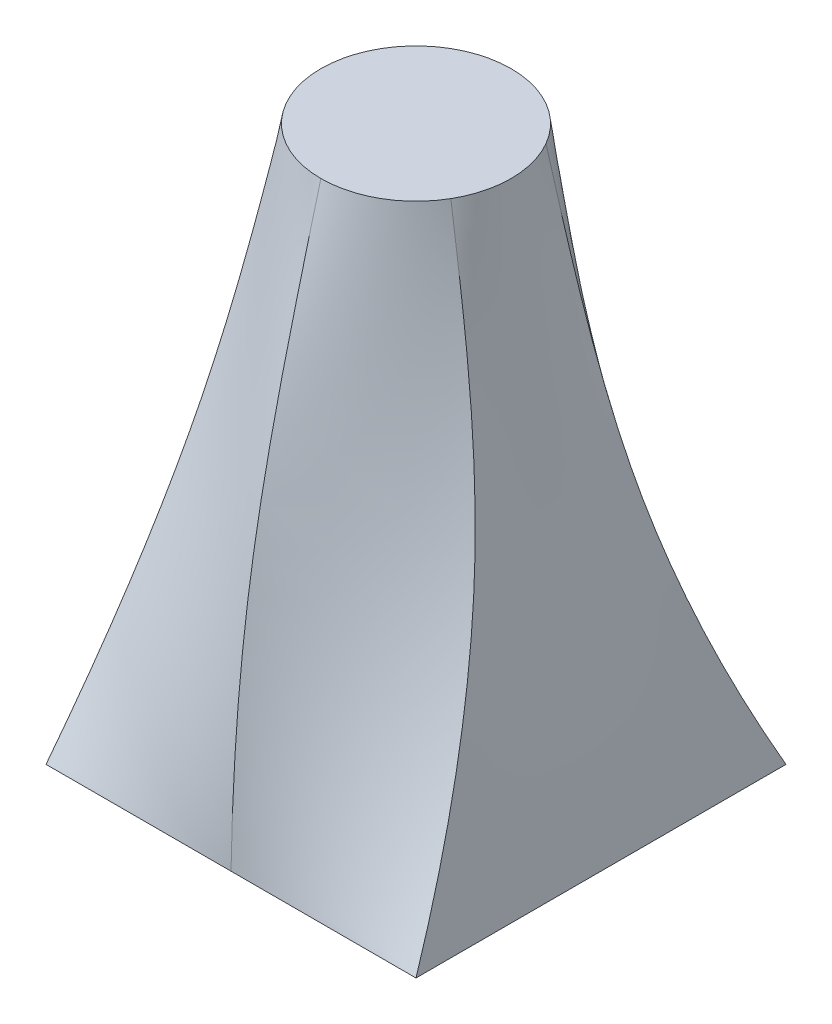
ISO-10303-21;
HEADER;
FILE_DESCRIPTION(('STEP AP214'),'2;1');
FILE_NAME('part.step','',(''),(''),'','','');
FILE_SCHEMA(('AUTOMOTIVE_DESIGN { 1 0 10303 214 1 1 1 1 }'));
ENDSEC;
DATA;
#1=APPLICATION_CONTEXT('core data for automotive mechanical design processes');
#2=APPLICATION_PROTOCOL_DEFINITION('international standard','automotive_design',2000,#1);
#3=PRODUCT_CONTEXT('',#1,'mechanical');
#4=PRODUCT('Part','Part','',(#3));
#5=PRODUCT_RELATED_PRODUCT_CATEGORY('part','',(#4));
#6=PRODUCT_DEFINITION_FORMATION('','',#4);
#7=PRODUCT_DEFINITION_CONTEXT('part definition',#1,'design');
#8=PRODUCT_DEFINITION('design','',#6,#7);
#9=PRODUCT_DEFINITION_SHAPE('','',#8);
#10=(LENGTH_UNIT() NAMED_UNIT(*) SI_UNIT(.MILLI.,.METRE.));
#11=(NAMED_UNIT(*) PLANE_ANGLE_UNIT() SI_UNIT($,.RADIAN.));
#12=(NAMED_UNIT(*) SI_UNIT($,.STERADIAN.) SOLID_ANGLE_UNIT());
#13=UNCERTAINTY_MEASURE_WITH_UNIT(LENGTH_MEASURE(1.E-05),#10,'distance_accuracy_value','');
#14=(GEOMETRIC_REPRESENTATION_CONTEXT(3) GLOBAL_UNCERTAINTY_ASSIGNED_CONTEXT((#13)) GLOBAL_UNIT_ASSIGNED_CONTEXT((#10,
#11,#12)) REPRESENTATION_CONTEXT('',''));
#15=CARTESIAN_POINT('',(0.,0.,0.));
#16=DIRECTION('',(0.,0.,1.));
#17=DIRECTION('',(1.,0.,0.));
#18=AXIS2_PLACEMENT_3D('',#15,#16,#17);
#19=CARTESIAN_POINT('',(0.,152.4,0.));
#20=DIRECTION('',(0.,1.,0.));
#21=DIRECTION('',(0.,0.,1.));
#22=AXIS2_PLACEMENT_3D('',#19,#20,#21);
#23=PLANE('',#22);
#24=CARTESIAN_POINT('',(0.,152.4,0.));
#25=DIRECTION('',(0.,1.,0.));
#26=DIRECTION('',(0.,0.,1.));
#27=AXIS2_PLACEMENT_3D('',#24,#25,#26);
#28=CIRCLE('',#27,26.1274271172022);
#29=CARTESIAN_POINT('',(0.,152.4,-26.1274271172022));
#30=VERTEX_POINT('',#29);
#31=CARTESIAN_POINT('',(-22.6270156190236,152.4,-13.0637135586011));
#32=VERTEX_POINT('',#31);
#33=EDGE_CURVE('E12',#30,#32,#28,.T.);
#34=ORIENTED_EDGE('',*,*,#33,.T.);
#35=CARTESIAN_POINT('',(-22.6270156190235,152.4,13.0637135586012));
#36=VERTEX_POINT('',#35);
#37=EDGE_CURVE('E89',#32,#36,#28,.T.);
#38=ORIENTED_EDGE('',*,*,#37,.T.);
#39=CARTESIAN_POINT('',(0.,152.4,26.1274271172022));
#40=VERTEX_POINT('',#39);
#41=EDGE_CURVE('E253',#36,#40,#28,.T.);
#42=ORIENTED_EDGE('',*,*,#41,.T.);
#43=CARTESIAN_POINT('',(22.6270156190236,152.4,13.0637135586009));
#44=VERTEX_POINT('',#43);
#45=EDGE_CURVE('E103',#40,#44,#28,.T.);
#46=ORIENTED_EDGE('',*,*,#45,.T.);
#47=CARTESIAN_POINT('',(22.6270156190234,152.4,-13.0637135586014));
#48=VERTEX_POINT('',#47);
#49=EDGE_CURVE('E97',#44,#48,#28,.T.);
#50=ORIENTED_EDGE('',*,*,#49,.T.);
#51=EDGE_CURVE('E166',#48,#30,#28,.T.);
#52=ORIENTED_EDGE('',*,*,#51,.T.);
#53=EDGE_LOOP('',(#34,#38,#42,#46,#50,#52));
#54=FACE_BOUND('',#53,.T.);
#55=ADVANCED_FACE('F79',(#54),#23,.T.);
#56=CARTESIAN_POINT('',(0.,0.,0.));
#57=DIRECTION('',(0.,1.,0.));
#58=DIRECTION('',(0.,0.,1.));
#59=AXIS2_PLACEMENT_3D('',#56,#57,#58);
#60=PLANE('',#59);
#61=DIRECTION('',(0.,0.,-1.));
#62=VECTOR('',#61,1.);
#63=CARTESIAN_POINT('',(50.8,0.,50.8));
#64=LINE('',#63,#62);
#65=CARTESIAN_POINT('',(50.8,0.,50.8));
#66=VERTEX_POINT('',#65);
#67=CARTESIAN_POINT('',(50.8,0.,-50.8));
#68=VERTEX_POINT('',#67);
#69=EDGE_CURVE('E141',#66,#68,#64,.T.);
#70=ORIENTED_EDGE('',*,*,#69,.F.);
#71=DIRECTION('',(1.,0.,0.));
#72=VECTOR('',#71,1.);
#73=CARTESIAN_POINT('',(0.,0.,50.8));
#74=LINE('',#73,#72);
#75=CARTESIAN_POINT('',(0.,0.,50.8));
#76=VERTEX_POINT('',#75);
#77=EDGE_CURVE('E161',#76,#66,#74,.T.);
#78=ORIENTED_EDGE('',*,*,#77,.F.);
#79=CARTESIAN_POINT('',(-50.8,0.,50.8));
#80=VERTEX_POINT('',#79);
#81=EDGE_CURVE('E321',#80,#76,#74,.T.);
#82=ORIENTED_EDGE('',*,*,#81,.F.);
#83=DIRECTION('',(0.,0.,1.));
#84=VECTOR('',#83,1.);
#85=CARTESIAN_POINT('',(-50.8,0.,50.8));
#86=LINE('',#85,#84);
#87=CARTESIAN_POINT('',(-50.8,0.,-50.8));
#88=VERTEX_POINT('',#87);
#89=EDGE_CURVE('E323',#88,#80,#86,.T.);
#90=ORIENTED_EDGE('',*,*,#89,.F.);
#91=DIRECTION('',(-1.,0.,0.));
#92=VECTOR('',#91,1.);
#93=CARTESIAN_POINT('',(-50.8,0.,-50.8));
#94=LINE('',#93,#92);
#95=CARTESIAN_POINT('',(0.,0.,-50.8));
#96=VERTEX_POINT('',#95);
#97=EDGE_CURVE('E144',#96,#88,#94,.T.);
#98=ORIENTED_EDGE('',*,*,#97,.F.);
#99=EDGE_CURVE('E136',#68,#96,#94,.T.);
#100=ORIENTED_EDGE('',*,*,#99,.F.);
#101=EDGE_LOOP('',(#70,#78,#82,#90,#98,#100));
#102=FACE_BOUND('',#101,.T.);
#103=ADVANCED_FACE('F139',(#102),#60,.F.);
#104=CARTESIAN_POINT('',(0.,0.,-50.8));
#105=CARTESIAN_POINT('',(0.,25.6908217722971,-50.3277403273931));
#106=CARTESIAN_POINT('',(0.,75.130372974673,-46.5546035508088));
#107=CARTESIAN_POINT('',(0.,126.816525625646,-32.8907332822273));
#108=CARTESIAN_POINT('',(0.,152.4,-26.1274271172022));
#109=CARTESIAN_POINT('',(-16.9333333333333,0.,-50.8));
#110=CARTESIAN_POINT('',(-15.7175956893417,25.3703698247562,-46.2363083796364));
#111=CARTESIAN_POINT('',(-12.4178114498651,75.264719863663,-35.7229825206091));
#112=CARTESIAN_POINT('',(-10.3544065437536,126.861007012758,-29.3044535274667));
#113=CARTESIAN_POINT('',(-9.33306787117156,152.4,-26.1274271172022));
#114=CARTESIAN_POINT('',(-33.8666666666667,0.,-50.8));
#115=CARTESIAN_POINT('',(-31.4351913786833,25.0499178772152,-42.1448764318797));
#116=CARTESIAN_POINT('',(-25.0416256537775,75.3990667526531,-26.3454846270585));
#117=CARTESIAN_POINT('',(-20.3050027103986,126.905488399871,-22.8677749278534));
#118=CARTESIAN_POINT('',(-17.9604816834378,152.4,-21.14638743028));
#119=CARTESIAN_POINT('',(-50.8,0.,-50.8));
#120=CARTESIAN_POINT('',(-47.1527870680249,24.7294659296742,-38.0534444841229));
#121=CARTESIAN_POINT('',(-38.8217460572351,75.5334136416432,-17.873451920087));
#122=CARTESIAN_POINT('',(-27.9889862550376,126.949969786983,-14.6561868609258));
#123=CARTESIAN_POINT('',(-22.6270156190236,152.4,-13.0637135586011));
#124=B_SPLINE_SURFACE_WITH_KNOTS('',3,3,((#104,#105,#106,#107,#108),(#109,#110,#111,#112,#113),
(#114,#115,#116,#117,#118),(#119,#120,#121,#122,#123)),.UNSPECIFIED.,.F.,.F.,.F.,(4,4),(4,1,4),
(0.,1.),(0.,0.505022659606439,1.),.UNSPECIFIED.);
#125=CARTESIAN_POINT('',(-50.8,0.,-50.8));
#126=CARTESIAN_POINT('',(-47.1527870680249,24.7294659296742,-38.0534444841229));
#127=CARTESIAN_POINT('',(-38.8217460572351,75.5334136416432,-17.873451920087));
#128=CARTESIAN_POINT('',(-27.9889862550376,126.949969786983,-14.6561868609258));
#129=CARTESIAN_POINT('',(-22.6270156190236,152.4,-13.0637135586011));
#130=B_SPLINE_CURVE_WITH_KNOTS('',3,(#125,#126,#127,#128,#129),.UNSPECIFIED.,.F.,.F.,(4,1,4),
(0.,0.505022659606439,1.),.UNSPECIFIED.);
#131=EDGE_CURVE('E185',#88,#32,#130,.T.);
#132=CARTESIAN_POINT('',(0.,0.,-50.8));
#133=CARTESIAN_POINT('',(0.,25.6908217722971,-50.3277403273931));
#134=CARTESIAN_POINT('',(0.,75.130372974673,-46.5546035508088));
#135=CARTESIAN_POINT('',(0.,126.816525625646,-32.8907332822273));
#136=CARTESIAN_POINT('',(0.,152.4,-26.1274271172022));
#137=B_SPLINE_CURVE_WITH_KNOTS('',3,(#132,#133,#134,#135,#136),.UNSPECIFIED.,.F.,.F.,(4,1,4),
(0.,0.505022659606439,1.),.UNSPECIFIED.);
#138=EDGE_CURVE('E149',#30,#96,#137,.F.);
#139=ORIENTED_EDGE('',*,*,#97,.T.);
#140=ORIENTED_EDGE('',*,*,#131,.T.);
#141=ORIENTED_EDGE('',*,*,#33,.F.);
#142=ORIENTED_EDGE('',*,*,#138,.T.);
#143=EDGE_LOOP('',(#139,#140,#141,#142));
#144=FACE_BOUND('',#143,.T.);
#145=ADVANCED_FACE('F202',(#144),#124,.T.);
#146=CARTESIAN_POINT('',(-50.8,0.,-50.8));
#147=CARTESIAN_POINT('',(-47.1527870680249,24.7294659296742,-38.0534444841229));
#148=CARTESIAN_POINT('',(-38.8217460572351,75.5334136416432,-17.873451920087));
#149=CARTESIAN_POINT('',(-27.9889862550376,126.949969786983,-14.6561868609258));
#150=CARTESIAN_POINT('',(-22.6270156190236,152.4,-13.0637135586011));
#151=CARTESIAN_POINT('',(-50.8,0.,-16.9333333333333));
#152=CARTESIAN_POINT('',(-47.152787068025,24.7294659296742,-12.6844814947077));
#153=CARTESIAN_POINT('',(-37.4594371036426,75.5334136416432,-5.77493132333897));
#154=CARTESIAN_POINT('',(-30.6594092541522,126.949969786983,-5.24389207948806));
#155=CARTESIAN_POINT('',(-27.2935495546093,152.4,-4.98103968692212));
#156=CARTESIAN_POINT('',(-50.8,0.,16.9333333333333));
#157=CARTESIAN_POINT('',(-47.152787068025,24.7294659296742,12.6844814947076));
#158=CARTESIAN_POINT('',(-37.4594371036426,75.5334136416432,5.77493132333894));
#159=CARTESIAN_POINT('',(-30.6594092541522,126.949969786983,5.24389207948816));
#160=CARTESIAN_POINT('',(-27.2935495546093,152.4,4.9810396869223));
#161=CARTESIAN_POINT('',(-50.8,0.,50.8));
#162=CARTESIAN_POINT('',(-47.152787068025,24.7294659296742,38.0534444841229));
#163=CARTESIAN_POINT('',(-38.8217460572351,75.5334136416432,17.873451920087));
#164=CARTESIAN_POINT('',(-27.9889862550375,126.949969786983,14.6561868609259));
#165=CARTESIAN_POINT('',(-22.6270156190235,152.4,13.0637135586012));
#166=B_SPLINE_SURFACE_WITH_KNOTS('',3,3,((#146,#147,#148,#149,#150),(#151,#152,#153,#154,#155),
(#156,#157,#158,#159,#160),(#161,#162,#163,#164,#165)),.UNSPECIFIED.,.F.,.F.,.F.,(4,4),(4,1,4),
(0.,1.),(0.,0.505022659606439,1.),.UNSPECIFIED.);
#167=CARTESIAN_POINT('',(-50.8,0.,50.8));
#168=CARTESIAN_POINT('',(-47.152787068025,24.7294659296742,38.0534444841229));
#169=CARTESIAN_POINT('',(-38.8217460572351,75.5334136416432,17.873451920087));
#170=CARTESIAN_POINT('',(-27.9889862550375,126.949969786983,14.6561868609259));
#171=CARTESIAN_POINT('',(-22.6270156190235,152.4,13.0637135586012));
#172=B_SPLINE_CURVE_WITH_KNOTS('',3,(#167,#168,#169,#170,#171),.UNSPECIFIED.,.F.,.F.,(4,1,4),
(0.,0.505022659606439,1.),.UNSPECIFIED.);
#173=EDGE_CURVE('E295',#80,#36,#172,.T.);
#174=ORIENTED_EDGE('',*,*,#89,.T.);
#175=ORIENTED_EDGE('',*,*,#173,.T.);
#176=ORIENTED_EDGE('',*,*,#37,.F.);
#177=ORIENTED_EDGE('',*,*,#131,.F.);
#178=EDGE_LOOP('',(#174,#175,#176,#177));
#179=FACE_BOUND('',#178,.T.);
#180=ADVANCED_FACE('F214',(#179),#166,.T.);
#181=CARTESIAN_POINT('',(50.8,0.,-50.8));
#182=CARTESIAN_POINT('',(47.152787068025,24.7294659296742,-38.0534444841229));
#183=CARTESIAN_POINT('',(38.8217460572352,75.5334136416432,-17.8734519200869));
#184=CARTESIAN_POINT('',(27.9889862550375,126.949969786983,-14.656186860926));
#185=CARTESIAN_POINT('',(22.6270156190234,152.4,-13.0637135586014));
#186=CARTESIAN_POINT('',(33.8666666666667,0.,-50.8));
#187=CARTESIAN_POINT('',(31.4351913786833,25.0499178772152,-42.1448764318796));
#188=CARTESIAN_POINT('',(25.0416256537776,75.3990667526531,-26.3454846270585));
#189=CARTESIAN_POINT('',(20.3050027103985,126.905488399871,-22.8677749278535));
#190=CARTESIAN_POINT('',(17.9604816834376,152.4,-21.1463874302801));
#191=CARTESIAN_POINT('',(16.9333333333333,0.,-50.8));
#192=CARTESIAN_POINT('',(15.7175956893416,25.3703698247562,-46.2363083796363));
#193=CARTESIAN_POINT('',(12.4178114498651,75.264719863663,-35.7229825206091));
#194=CARTESIAN_POINT('',(10.3544065437536,126.861007012758,-29.3044535274667));
#195=CARTESIAN_POINT('',(9.33306787117143,152.4,-26.1274271172022));
#196=CARTESIAN_POINT('',(0.,0.,-50.8));
#197=CARTESIAN_POINT('',(0.,25.6908217722971,-50.3277403273931));
#198=CARTESIAN_POINT('',(0.,75.130372974673,-46.5546035508088));
#199=CARTESIAN_POINT('',(0.,126.816525625646,-32.8907332822273));
#200=CARTESIAN_POINT('',(0.,152.4,-26.1274271172022));
#201=B_SPLINE_SURFACE_WITH_KNOTS('',3,3,((#181,#182,#183,#184,#185),(#186,#187,#188,#189,#190),
(#191,#192,#193,#194,#195),(#196,#197,#198,#199,#200)),.UNSPECIFIED.,.F.,.F.,.F.,(4,4),(4,1,4),
(0.,1.),(0.,0.505022659606439,1.),.UNSPECIFIED.);
#202=CARTESIAN_POINT('',(50.8,0.,-50.8));
#203=CARTESIAN_POINT('',(47.152787068025,24.7294659296742,-38.0534444841229));
#204=CARTESIAN_POINT('',(38.8217460572352,75.5334136416432,-17.8734519200869));
#205=CARTESIAN_POINT('',(27.9889862550375,126.949969786983,-14.656186860926));
#206=CARTESIAN_POINT('',(22.6270156190234,152.4,-13.0637135586014));
#207=B_SPLINE_CURVE_WITH_KNOTS('',3,(#202,#203,#204,#205,#206),.UNSPECIFIED.,.F.,.F.,(4,1,4),
(0.,0.505022659606439,1.),.UNSPECIFIED.);
#208=EDGE_CURVE('E158',#68,#48,#207,.T.);
#209=ORIENTED_EDGE('',*,*,#99,.T.);
#210=ORIENTED_EDGE('',*,*,#138,.F.);
#211=ORIENTED_EDGE('',*,*,#51,.F.);
#212=ORIENTED_EDGE('',*,*,#208,.F.);
#213=EDGE_LOOP('',(#209,#210,#211,#212));
#214=FACE_BOUND('',#213,.T.);
#215=ADVANCED_FACE('F165',(#214),#201,.T.);
#216=CARTESIAN_POINT('',(-50.8,0.,50.8));
#217=CARTESIAN_POINT('',(-47.152787068025,24.7294659296742,38.0534444841229));
#218=CARTESIAN_POINT('',(-38.8217460572351,75.5334136416432,17.873451920087));
#219=CARTESIAN_POINT('',(-27.9889862550375,126.949969786983,14.6561868609259));
#220=CARTESIAN_POINT('',(-22.6270156190235,152.4,13.0637135586012));
#221=CARTESIAN_POINT('',(-33.8666666666667,0.,50.8));
#222=CARTESIAN_POINT('',(-31.4351913786833,25.0499178772152,42.1448764318796));
#223=CARTESIAN_POINT('',(-25.0416256537775,75.3990667526531,26.3454846270585));
#224=CARTESIAN_POINT('',(-20.3050027103985,126.905488399871,22.8677749278535));
#225=CARTESIAN_POINT('',(-17.9604816834377,152.4,21.1463874302801));
#226=CARTESIAN_POINT('',(-16.9333333333333,0.,50.8));
#227=CARTESIAN_POINT('',(-15.7175956893417,25.3703698247562,46.2363083796364));
#228=CARTESIAN_POINT('',(-12.4178114498651,75.264719863663,35.7229825206091));
#229=CARTESIAN_POINT('',(-10.3544065437536,126.861007012758,29.3044535274668));
#230=CARTESIAN_POINT('',(-9.3330678711715,152.4,26.1274271172022));
#231=CARTESIAN_POINT('',(0.,0.,50.8));
#232=CARTESIAN_POINT('',(0.,25.6908217722971,50.3277403273931));
#233=CARTESIAN_POINT('',(0.,75.130372974673,46.5546035508088));
#234=CARTESIAN_POINT('',(0.,126.816525625646,32.8907332822273));
#235=CARTESIAN_POINT('',(0.,152.4,26.1274271172022));
#236=B_SPLINE_SURFACE_WITH_KNOTS('',3,3,((#216,#217,#218,#219,#220),(#221,#222,#223,#224,#225),
(#226,#227,#228,#229,#230),(#231,#232,#233,#234,#235)),.UNSPECIFIED.,.F.,.F.,.F.,(4,4),(4,1,4),
(0.,1.),(0.,0.505022659606439,1.),.UNSPECIFIED.);
#237=CARTESIAN_POINT('',(0.,0.,50.8));
#238=CARTESIAN_POINT('',(0.,25.6908217722971,50.3277403273931));
#239=CARTESIAN_POINT('',(0.,75.130372974673,46.5546035508088));
#240=CARTESIAN_POINT('',(0.,126.816525625646,32.8907332822273));
#241=CARTESIAN_POINT('',(0.,152.4,26.1274271172022));
#242=B_SPLINE_CURVE_WITH_KNOTS('',3,(#237,#238,#239,#240,#241),.UNSPECIFIED.,.F.,.F.,(4,1,4),
(0.,0.505022659606439,1.),.UNSPECIFIED.);
#243=EDGE_CURVE('E170',#76,#40,#242,.T.);
#244=ORIENTED_EDGE('',*,*,#81,.T.);
#245=ORIENTED_EDGE('',*,*,#243,.T.);
#246=ORIENTED_EDGE('',*,*,#41,.F.);
#247=ORIENTED_EDGE('',*,*,#173,.F.);
#248=EDGE_LOOP('',(#244,#245,#246,#247));
#249=FACE_BOUND('',#248,.T.);
#250=ADVANCED_FACE('F259',(#249),#236,.T.);
#251=CARTESIAN_POINT('',(0.,0.,50.8));
#252=CARTESIAN_POINT('',(0.,25.6908217722971,50.3277403273931));
#253=CARTESIAN_POINT('',(0.,75.130372974673,46.5546035508088));
#254=CARTESIAN_POINT('',(0.,126.816525625646,32.8907332822273));
#255=CARTESIAN_POINT('',(0.,152.4,26.1274271172022));
#256=CARTESIAN_POINT('',(16.9333333333333,0.,50.8));
#257=CARTESIAN_POINT('',(15.7175956893416,25.3703698247562,46.2363083796364));
#258=CARTESIAN_POINT('',(12.4178114498651,75.264719863663,35.7229825206091));
#259=CARTESIAN_POINT('',(10.3544065437537,126.861007012758,29.3044535274667));
#260=CARTESIAN_POINT('',(9.33306787117162,152.4,26.1274271172022));
#261=CARTESIAN_POINT('',(33.8666666666667,0.,50.8));
#262=CARTESIAN_POINT('',(31.4351913786833,25.0499178772152,42.1448764318797));
#263=CARTESIAN_POINT('',(25.0416256537775,75.3990667526531,26.3454846270585));
#264=CARTESIAN_POINT('',(20.3050027103987,126.905488399871,22.8677749278534));
#265=CARTESIAN_POINT('',(17.9604816834379,152.4,21.1463874302799));
#266=CARTESIAN_POINT('',(50.8,0.,50.8));
#267=CARTESIAN_POINT('',(47.1527870680249,24.7294659296742,38.053444484123));
#268=CARTESIAN_POINT('',(38.8217460572351,75.5334136416432,17.873451920087));
#269=CARTESIAN_POINT('',(27.9889862550376,126.949969786983,14.6561868609257));
#270=CARTESIAN_POINT('',(22.6270156190236,152.4,13.0637135586009));
#271=B_SPLINE_SURFACE_WITH_KNOTS('',3,3,((#251,#252,#253,#254,#255),(#256,#257,#258,#259,#260),
(#261,#262,#263,#264,#265),(#266,#267,#268,#269,#270)),.UNSPECIFIED.,.F.,.F.,.F.,(4,4),(4,1,4),
(0.,1.),(0.,0.505022659606439,1.),.UNSPECIFIED.);
#272=CARTESIAN_POINT('',(50.8,0.,50.8));
#273=CARTESIAN_POINT('',(47.1527870680249,24.7294659296742,38.053444484123));
#274=CARTESIAN_POINT('',(38.8217460572351,75.5334136416432,17.873451920087));
#275=CARTESIAN_POINT('',(27.9889862550376,126.949969786983,14.6561868609257));
#276=CARTESIAN_POINT('',(22.6270156190236,152.4,13.0637135586009));
#277=B_SPLINE_CURVE_WITH_KNOTS('',3,(#272,#273,#274,#275,#276),.UNSPECIFIED.,.F.,.F.,(4,1,4),
(0.,0.505022659606439,1.),.UNSPECIFIED.);
#278=EDGE_CURVE('E160',#66,#44,#277,.T.);
#279=ORIENTED_EDGE('',*,*,#77,.T.);
#280=ORIENTED_EDGE('',*,*,#278,.T.);
#281=ORIENTED_EDGE('',*,*,#45,.F.);
#282=ORIENTED_EDGE('',*,*,#243,.F.);
#283=EDGE_LOOP('',(#279,#280,#281,#282));
#284=FACE_BOUND('',#283,.T.);
#285=ADVANCED_FACE('F270',(#284),#271,.T.);
#286=CARTESIAN_POINT('',(50.8,0.,50.8));
#287=CARTESIAN_POINT('',(47.1527870680249,24.7294659296742,38.053444484123));
#288=CARTESIAN_POINT('',(38.8217460572351,75.5334136416432,17.873451920087));
#289=CARTESIAN_POINT('',(27.9889862550376,126.949969786983,14.6561868609257));
#290=CARTESIAN_POINT('',(22.6270156190237,152.4,13.0637135586009));
#291=CARTESIAN_POINT('',(50.8,0.,16.9333333333333));
#292=CARTESIAN_POINT('',(47.152787068025,24.7294659296742,12.6844814947077));
#293=CARTESIAN_POINT('',(37.4594371036426,75.5334136416432,5.774931323339));
#294=CARTESIAN_POINT('',(30.6594092541523,126.949969786983,5.24389207948794));
#295=CARTESIAN_POINT('',(27.2935495546094,152.4,4.98103968692193));
#296=CARTESIAN_POINT('',(50.8,0.,-16.9333333333333));
#297=CARTESIAN_POINT('',(47.152787068025,24.7294659296742,-12.6844814947076));
#298=CARTESIAN_POINT('',(37.4594371036426,75.5334136416432,-5.77493132333889));
#299=CARTESIAN_POINT('',(30.6594092541522,126.949969786983,-5.24389207948828));
#300=CARTESIAN_POINT('',(27.2935495546092,152.4,-4.9810396869225));
#301=CARTESIAN_POINT('',(50.8,0.,-50.8));
#302=CARTESIAN_POINT('',(47.152787068025,24.7294659296742,-38.0534444841229));
#303=CARTESIAN_POINT('',(38.8217460572352,75.5334136416432,-17.8734519200869));
#304=CARTESIAN_POINT('',(27.9889862550375,126.949969786983,-14.656186860926));
#305=CARTESIAN_POINT('',(22.6270156190234,152.4,-13.0637135586014));
#306=B_SPLINE_SURFACE_WITH_KNOTS('',3,3,((#286,#287,#288,#289,#290),(#291,#292,#293,#294,#295),
(#296,#297,#298,#299,#300),(#301,#302,#303,#304,#305)),.UNSPECIFIED.,.F.,.F.,.F.,(4,4),(4,1,4),
(0.,1.),(0.,0.505022659606439,1.),.UNSPECIFIED.);
#307=ORIENTED_EDGE('',*,*,#69,.T.);
#308=ORIENTED_EDGE('',*,*,#208,.T.);
#309=ORIENTED_EDGE('',*,*,#49,.F.);
#310=ORIENTED_EDGE('',*,*,#278,.F.);
#311=EDGE_LOOP('',(#307,#308,#309,#310));
#312=FACE_BOUND('',#311,.T.);
#313=ADVANCED_FACE('F157',(#312),#306,.T.);
#314=CLOSED_SHELL('',(#55,#103,#145,#180,#215,#250,#285,#313));
#315=MANIFOLD_SOLID_BREP('B2',#314);
#316=ADVANCED_BREP_SHAPE_REPRESENTATION('',(#18,#315),#14);
#317=SHAPE_DEFINITION_REPRESENTATION(#9,#316);
ENDSEC;
END-ISO-10303-21;
